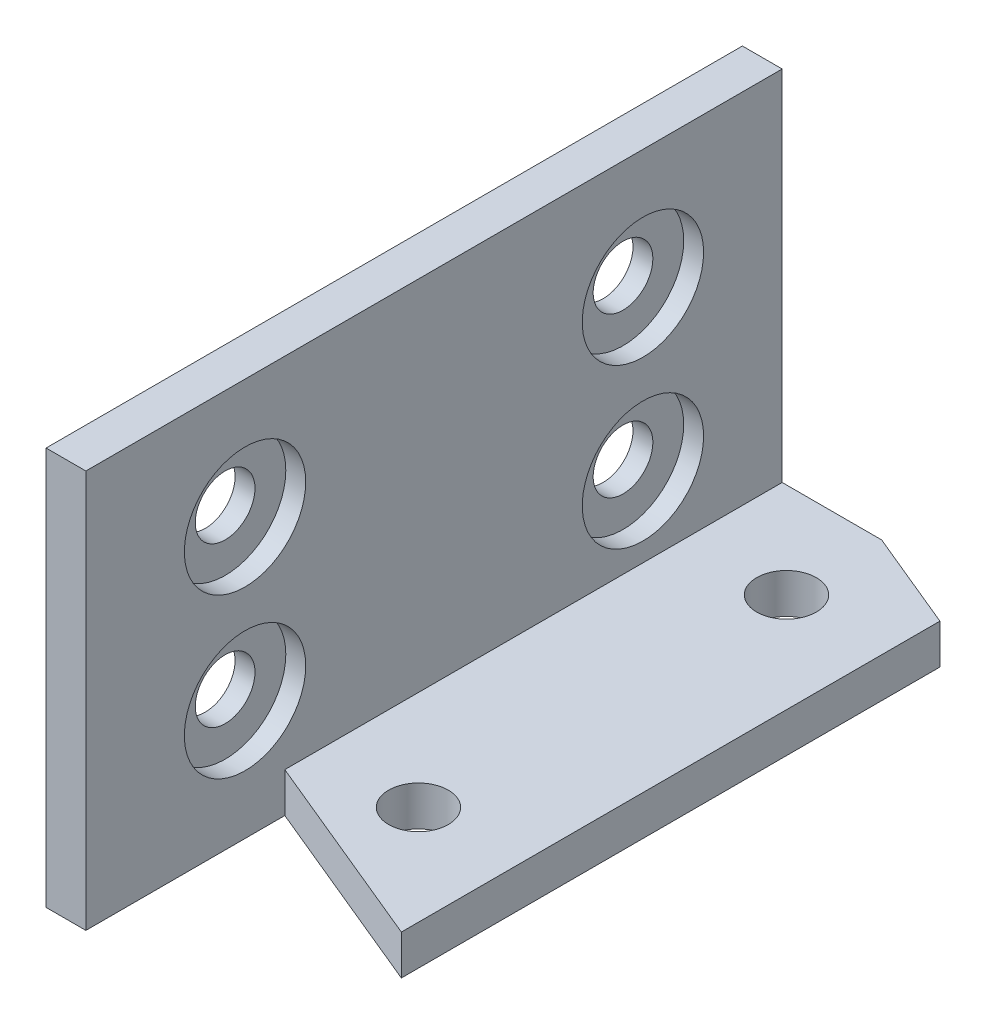
ISO-10303-21;
HEADER;
FILE_DESCRIPTION(('STEP AP214'),'2;1');
FILE_NAME('part.step','',(''),(''),'','','');
FILE_SCHEMA(('AUTOMOTIVE_DESIGN { 1 0 10303 214 1 1 1 1 }'));
ENDSEC;
DATA;
#1=APPLICATION_CONTEXT('core data for automotive mechanical design processes');
#2=APPLICATION_PROTOCOL_DEFINITION('international standard','automotive_design',2000,#1);
#3=PRODUCT_CONTEXT('',#1,'mechanical');
#4=PRODUCT('Part','Part','',(#3));
#5=PRODUCT_RELATED_PRODUCT_CATEGORY('part','',(#4));
#6=PRODUCT_DEFINITION_FORMATION('','',#4);
#7=PRODUCT_DEFINITION_CONTEXT('part definition',#1,'design');
#8=PRODUCT_DEFINITION('design','',#6,#7);
#9=PRODUCT_DEFINITION_SHAPE('','',#8);
#10=(LENGTH_UNIT() NAMED_UNIT(*) SI_UNIT(.MILLI.,.METRE.));
#11=(NAMED_UNIT(*) PLANE_ANGLE_UNIT() SI_UNIT($,.RADIAN.));
#12=(NAMED_UNIT(*) SI_UNIT($,.STERADIAN.) SOLID_ANGLE_UNIT());
#13=UNCERTAINTY_MEASURE_WITH_UNIT(LENGTH_MEASURE(1.E-05),#10,'distance_accuracy_value','');
#14=(GEOMETRIC_REPRESENTATION_CONTEXT(3) GLOBAL_UNCERTAINTY_ASSIGNED_CONTEXT((#13)) GLOBAL_UNIT_ASSIGNED_CONTEXT((#10,
#11,#12)) REPRESENTATION_CONTEXT('',''));
#15=CARTESIAN_POINT('',(0.,0.,0.));
#16=DIRECTION('',(0.,0.,1.));
#17=DIRECTION('',(1.,0.,0.));
#18=AXIS2_PLACEMENT_3D('',#15,#16,#17);
#19=CARTESIAN_POINT('',(-4.24264068711929,4.,-10.5));
#20=DIRECTION('',(1.,0.,0.));
#21=DIRECTION('',(0.,0.,-1.));
#22=AXIS2_PLACEMENT_3D('',#19,#20,#21);
#23=CYLINDRICAL_SURFACE('',#22,1.5);
#24=CARTESIAN_POINT('',(0.,4.,-10.5));
#25=DIRECTION('',(-1.,0.,0.));
#26=DIRECTION('',(0.,0.,1.));
#27=AXIS2_PLACEMENT_3D('',#24,#25,#26);
#28=CIRCLE('',#27,1.5);
#29=CARTESIAN_POINT('',(0.,4.,-9.));
#30=VERTEX_POINT('',#29);
#31=EDGE_CURVE('E179',#30,#30,#28,.F.);
#32=ORIENTED_EDGE('',*,*,#31,.F.);
#33=EDGE_LOOP('',(#32));
#34=FACE_BOUND('',#33,.T.);
#35=CARTESIAN_POINT('',(1.,4.,-10.5));
#36=DIRECTION('',(1.,0.,0.));
#37=DIRECTION('',(0.,0.,-1.));
#38=AXIS2_PLACEMENT_3D('',#35,#36,#37);
#39=CIRCLE('',#38,1.5);
#40=CARTESIAN_POINT('',(1.,4.,-12.));
#41=VERTEX_POINT('',#40);
#42=EDGE_CURVE('E49',#41,#41,#39,.F.);
#43=ORIENTED_EDGE('',*,*,#42,.F.);
#44=EDGE_LOOP('',(#43));
#45=FACE_BOUND('',#44,.T.);
#46=ADVANCED_FACE('F45',(#34,#45),#23,.F.);
#47=CARTESIAN_POINT('',(-4.24264068711929,-4.,-10.5));
#48=DIRECTION('',(1.,0.,0.));
#49=DIRECTION('',(0.,0.,-1.));
#50=AXIS2_PLACEMENT_3D('',#47,#48,#49);
#51=CYLINDRICAL_SURFACE('',#50,1.5);
#52=CARTESIAN_POINT('',(0.,-4.,-10.5));
#53=DIRECTION('',(-1.,0.,0.));
#54=DIRECTION('',(0.,0.,1.));
#55=AXIS2_PLACEMENT_3D('',#52,#53,#54);
#56=CIRCLE('',#55,1.5);
#57=CARTESIAN_POINT('',(0.,-4.,-9.00000000000001));
#58=VERTEX_POINT('',#57);
#59=EDGE_CURVE('E175',#58,#58,#56,.F.);
#60=ORIENTED_EDGE('',*,*,#59,.F.);
#61=EDGE_LOOP('',(#60));
#62=FACE_BOUND('',#61,.T.);
#63=CARTESIAN_POINT('',(1.,-4.,-10.5));
#64=DIRECTION('',(1.,0.,0.));
#65=DIRECTION('',(0.,0.,-1.));
#66=AXIS2_PLACEMENT_3D('',#63,#64,#65);
#67=CIRCLE('',#66,1.5);
#68=CARTESIAN_POINT('',(1.,-4.,-12.));
#69=VERTEX_POINT('',#68);
#70=EDGE_CURVE('E228',#69,#69,#67,.F.);
#71=ORIENTED_EDGE('',*,*,#70,.F.);
#72=EDGE_LOOP('',(#71));
#73=FACE_BOUND('',#72,.T.);
#74=ADVANCED_FACE('F314',(#62,#73),#51,.F.);
#75=CARTESIAN_POINT('',(-4.24264068711929,-4.,9.5));
#76=DIRECTION('',(1.,0.,0.));
#77=DIRECTION('',(0.,0.,-1.));
#78=AXIS2_PLACEMENT_3D('',#75,#76,#77);
#79=CYLINDRICAL_SURFACE('',#78,1.5);
#80=CARTESIAN_POINT('',(0.,-4.,9.5));
#81=DIRECTION('',(-1.,0.,0.));
#82=DIRECTION('',(0.,0.,1.));
#83=AXIS2_PLACEMENT_3D('',#80,#81,#82);
#84=CIRCLE('',#83,1.5);
#85=CARTESIAN_POINT('',(0.,-4.,11.));
#86=VERTEX_POINT('',#85);
#87=EDGE_CURVE('E180',#86,#86,#84,.F.);
#88=ORIENTED_EDGE('',*,*,#87,.F.);
#89=EDGE_LOOP('',(#88));
#90=FACE_BOUND('',#89,.T.);
#91=CARTESIAN_POINT('',(1.,-4.,9.5));
#92=DIRECTION('',(1.,0.,0.));
#93=DIRECTION('',(0.,0.,-1.));
#94=AXIS2_PLACEMENT_3D('',#91,#92,#93);
#95=CIRCLE('',#94,1.5);
#96=CARTESIAN_POINT('',(1.,-4.,8.));
#97=VERTEX_POINT('',#96);
#98=EDGE_CURVE('E224',#97,#97,#95,.F.);
#99=ORIENTED_EDGE('',*,*,#98,.F.);
#100=EDGE_LOOP('',(#99));
#101=FACE_BOUND('',#100,.T.);
#102=ADVANCED_FACE('F321',(#90,#101),#79,.F.);
#103=CARTESIAN_POINT('',(-4.24264068711929,4.,9.5));
#104=DIRECTION('',(1.,0.,0.));
#105=DIRECTION('',(0.,0.,-1.));
#106=AXIS2_PLACEMENT_3D('',#103,#104,#105);
#107=CYLINDRICAL_SURFACE('',#106,1.5);
#108=CARTESIAN_POINT('',(0.,4.,9.5));
#109=DIRECTION('',(-1.,0.,0.));
#110=DIRECTION('',(0.,0.,1.));
#111=AXIS2_PLACEMENT_3D('',#108,#109,#110);
#112=CIRCLE('',#111,1.5);
#113=CARTESIAN_POINT('',(0.,4.,11.));
#114=VERTEX_POINT('',#113);
#115=EDGE_CURVE('E169',#114,#114,#112,.F.);
#116=ORIENTED_EDGE('',*,*,#115,.F.);
#117=EDGE_LOOP('',(#116));
#118=FACE_BOUND('',#117,.T.);
#119=CARTESIAN_POINT('',(1.,4.,9.5));
#120=DIRECTION('',(1.,0.,0.));
#121=DIRECTION('',(0.,0.,-1.));
#122=AXIS2_PLACEMENT_3D('',#119,#120,#121);
#123=CIRCLE('',#122,1.5);
#124=CARTESIAN_POINT('',(1.,4.,8.));
#125=VERTEX_POINT('',#124);
#126=EDGE_CURVE('E220',#125,#125,#123,.F.);
#127=ORIENTED_EDGE('',*,*,#126,.F.);
#128=EDGE_LOOP('',(#127));
#129=FACE_BOUND('',#128,.T.);
#130=ADVANCED_FACE('F291',(#118,#129),#107,.F.);
#131=CARTESIAN_POINT('',(2.,0.,0.));
#132=DIRECTION('',(-1.,0.,0.));
#133=DIRECTION('',(0.,0.,1.));
#134=AXIS2_PLACEMENT_3D('',#131,#132,#133);
#135=PLANE('',#134);
#136=CARTESIAN_POINT('',(2.,4.,-10.5));
#137=DIRECTION('',(1.,0.,0.));
#138=DIRECTION('',(0.,0.,-1.));
#139=AXIS2_PLACEMENT_3D('',#136,#137,#138);
#140=CIRCLE('',#139,3.05);
#141=CARTESIAN_POINT('',(2.,4.,-13.55));
#142=VERTEX_POINT('',#141);
#143=EDGE_CURVE('E266',#142,#142,#140,.T.);
#144=ORIENTED_EDGE('',*,*,#143,.F.);
#145=EDGE_LOOP('',(#144));
#146=FACE_BOUND('',#145,.T.);
#147=CARTESIAN_POINT('',(2.,-4.,-10.5));
#148=DIRECTION('',(1.,0.,0.));
#149=DIRECTION('',(0.,0.,-1.));
#150=AXIS2_PLACEMENT_3D('',#147,#148,#149);
#151=CIRCLE('',#150,3.05);
#152=CARTESIAN_POINT('',(2.,-4.,-13.55));
#153=VERTEX_POINT('',#152);
#154=EDGE_CURVE('E274',#153,#153,#151,.T.);
#155=ORIENTED_EDGE('',*,*,#154,.F.);
#156=EDGE_LOOP('',(#155));
#157=FACE_BOUND('',#156,.T.);
#158=CARTESIAN_POINT('',(2.,-4.,9.5));
#159=DIRECTION('',(1.,0.,0.));
#160=DIRECTION('',(0.,0.,-1.));
#161=AXIS2_PLACEMENT_3D('',#158,#159,#160);
#162=CIRCLE('',#161,3.05);
#163=CARTESIAN_POINT('',(2.,-4.,6.45));
#164=VERTEX_POINT('',#163);
#165=EDGE_CURVE('E258',#164,#164,#162,.T.);
#166=ORIENTED_EDGE('',*,*,#165,.F.);
#167=EDGE_LOOP('',(#166));
#168=FACE_BOUND('',#167,.T.);
#169=CARTESIAN_POINT('',(2.,4.,9.5));
#170=DIRECTION('',(1.,0.,0.));
#171=DIRECTION('',(0.,0.,-1.));
#172=AXIS2_PLACEMENT_3D('',#169,#170,#171);
#173=CIRCLE('',#172,3.05);
#174=CARTESIAN_POINT('',(2.,4.,6.45));
#175=VERTEX_POINT('',#174);
#176=EDGE_CURVE('E254',#175,#175,#173,.T.);
#177=ORIENTED_EDGE('',*,*,#176,.F.);
#178=EDGE_LOOP('',(#177));
#179=FACE_BOUND('',#178,.T.);
#180=DIRECTION('',(0.,-1.,0.));
#181=VECTOR('',#180,1.);
#182=CARTESIAN_POINT('',(2.,-8.,7.5));
#183=LINE('',#182,#181);
#184=CARTESIAN_POINT('',(2.,-8.,7.5));
#185=VERTEX_POINT('',#184);
#186=CARTESIAN_POINT('',(2.,-10.,7.5));
#187=VERTEX_POINT('',#186);
#188=EDGE_CURVE('E166',#185,#187,#183,.T.);
#189=ORIENTED_EDGE('',*,*,#188,.F.);
#190=DIRECTION('',(0.,0.,-1.));
#191=VECTOR('',#190,1.);
#192=CARTESIAN_POINT('',(2.,-8.,-17.5));
#193=LINE('',#192,#191);
#194=CARTESIAN_POINT('',(2.,-8.,-17.5));
#195=VERTEX_POINT('',#194);
#196=EDGE_CURVE('E144',#185,#195,#193,.T.);
#197=ORIENTED_EDGE('',*,*,#196,.T.);
#198=DIRECTION('',(0.,1.,0.));
#199=VECTOR('',#198,1.);
#200=CARTESIAN_POINT('',(2.,-10.,-17.5));
#201=LINE('',#200,#199);
#202=CARTESIAN_POINT('',(2.,10.,-17.5));
#203=VERTEX_POINT('',#202);
#204=EDGE_CURVE('E97',#195,#203,#201,.T.);
#205=ORIENTED_EDGE('',*,*,#204,.T.);
#206=DIRECTION('',(0.,0.,1.));
#207=VECTOR('',#206,1.);
#208=CARTESIAN_POINT('',(2.,10.,17.5));
#209=LINE('',#208,#207);
#210=CARTESIAN_POINT('',(2.,10.,17.5));
#211=VERTEX_POINT('',#210);
#212=EDGE_CURVE('E193',#203,#211,#209,.T.);
#213=ORIENTED_EDGE('',*,*,#212,.T.);
#214=DIRECTION('',(0.,-1.,0.));
#215=VECTOR('',#214,1.);
#216=CARTESIAN_POINT('',(2.,-10.,17.5));
#217=LINE('',#216,#215);
#218=CARTESIAN_POINT('',(2.,-10.,17.5));
#219=VERTEX_POINT('',#218);
#220=EDGE_CURVE('E72',#211,#219,#217,.T.);
#221=ORIENTED_EDGE('',*,*,#220,.T.);
#222=DIRECTION('',(0.,0.,-1.));
#223=VECTOR('',#222,1.);
#224=CARTESIAN_POINT('',(2.,-10.,17.5));
#225=LINE('',#224,#223);
#226=EDGE_CURVE('E198',#219,#187,#225,.T.);
#227=ORIENTED_EDGE('',*,*,#226,.T.);
#228=EDGE_LOOP('',(#189,#197,#205,#213,#221,#227));
#229=FACE_BOUND('',#228,.T.);
#230=ADVANCED_FACE('F288',(#146,#157,#168,#179,#229),#135,.F.);
#231=CARTESIAN_POINT('',(2.,-10.,-17.5));
#232=DIRECTION('',(0.,0.,1.));
#233=DIRECTION('',(1.,0.,0.));
#234=AXIS2_PLACEMENT_3D('',#231,#232,#233);
#235=PLANE('',#234);
#236=DIRECTION('',(0.,1.,0.));
#237=VECTOR('',#236,1.);
#238=CARTESIAN_POINT('',(0.,-10.,-17.5));
#239=LINE('',#238,#237);
#240=CARTESIAN_POINT('',(0.,-10.,-17.5));
#241=VERTEX_POINT('',#240);
#242=CARTESIAN_POINT('',(0.,10.,-17.5));
#243=VERTEX_POINT('',#242);
#244=EDGE_CURVE('E190',#241,#243,#239,.T.);
#245=ORIENTED_EDGE('',*,*,#244,.T.);
#246=DIRECTION('',(-1.,0.,0.));
#247=VECTOR('',#246,1.);
#248=CARTESIAN_POINT('',(2.,10.,-17.5));
#249=LINE('',#248,#247);
#250=EDGE_CURVE('E11',#203,#243,#249,.T.);
#251=ORIENTED_EDGE('',*,*,#250,.F.);
#252=ORIENTED_EDGE('',*,*,#204,.F.);
#253=DIRECTION('',(1.,0.,0.));
#254=VECTOR('',#253,1.);
#255=CARTESIAN_POINT('',(2.,-8.,-17.5));
#256=LINE('',#255,#254);
#257=CARTESIAN_POINT('',(7.,-8.,-17.5));
#258=VERTEX_POINT('',#257);
#259=EDGE_CURVE('E63',#195,#258,#256,.T.);
#260=ORIENTED_EDGE('',*,*,#259,.T.);
#261=DIRECTION('',(0.,-1.,0.));
#262=VECTOR('',#261,1.);
#263=CARTESIAN_POINT('',(7.,-8.,-17.5));
#264=LINE('',#263,#262);
#265=CARTESIAN_POINT('',(7.,-10.,-17.5));
#266=VERTEX_POINT('',#265);
#267=EDGE_CURVE('E124',#258,#266,#264,.T.);
#268=ORIENTED_EDGE('',*,*,#267,.T.);
#269=DIRECTION('',(-1.,0.,0.));
#270=VECTOR('',#269,1.);
#271=CARTESIAN_POINT('',(2.,-10.,-17.5));
#272=LINE('',#271,#270);
#273=EDGE_CURVE('E201',#266,#241,#272,.T.);
#274=ORIENTED_EDGE('',*,*,#273,.T.);
#275=EDGE_LOOP('',(#245,#251,#252,#260,#268,#274));
#276=FACE_BOUND('',#275,.T.);
#277=ADVANCED_FACE('F47',(#276),#235,.F.);
#278=CARTESIAN_POINT('',(2.,10.,17.5));
#279=DIRECTION('',(0.,-1.,0.));
#280=DIRECTION('',(0.,0.,-1.));
#281=AXIS2_PLACEMENT_3D('',#278,#279,#280);
#282=PLANE('',#281);
#283=DIRECTION('',(0.,0.,1.));
#284=VECTOR('',#283,1.);
#285=CARTESIAN_POINT('',(0.,10.,17.5));
#286=LINE('',#285,#284);
#287=CARTESIAN_POINT('',(0.,10.,17.5));
#288=VERTEX_POINT('',#287);
#289=EDGE_CURVE('E204',#243,#288,#286,.T.);
#290=ORIENTED_EDGE('',*,*,#289,.T.);
#291=DIRECTION('',(-1.,0.,0.));
#292=VECTOR('',#291,1.);
#293=CARTESIAN_POINT('',(2.,10.,17.5));
#294=LINE('',#293,#292);
#295=EDGE_CURVE('E55',#211,#288,#294,.T.);
#296=ORIENTED_EDGE('',*,*,#295,.F.);
#297=ORIENTED_EDGE('',*,*,#212,.F.);
#298=ORIENTED_EDGE('',*,*,#250,.T.);
#299=EDGE_LOOP('',(#290,#296,#297,#298));
#300=FACE_BOUND('',#299,.T.);
#301=ADVANCED_FACE('F337',(#300),#282,.F.);
#302=CARTESIAN_POINT('',(2.,-10.,17.5));
#303=DIRECTION('',(0.,0.,-1.));
#304=DIRECTION('',(-1.,0.,0.));
#305=AXIS2_PLACEMENT_3D('',#302,#303,#304);
#306=PLANE('',#305);
#307=DIRECTION('',(0.,-1.,0.));
#308=VECTOR('',#307,1.);
#309=CARTESIAN_POINT('',(0.,-10.,17.5));
#310=LINE('',#309,#308);
#311=CARTESIAN_POINT('',(0.,-10.,17.5));
#312=VERTEX_POINT('',#311);
#313=EDGE_CURVE('E207',#288,#312,#310,.T.);
#314=ORIENTED_EDGE('',*,*,#313,.T.);
#315=DIRECTION('',(-1.,0.,0.));
#316=VECTOR('',#315,1.);
#317=CARTESIAN_POINT('',(2.,-10.,17.5));
#318=LINE('',#317,#316);
#319=EDGE_CURVE('E214',#219,#312,#318,.T.);
#320=ORIENTED_EDGE('',*,*,#319,.F.);
#321=ORIENTED_EDGE('',*,*,#220,.F.);
#322=ORIENTED_EDGE('',*,*,#295,.T.);
#323=EDGE_LOOP('',(#314,#320,#321,#322));
#324=FACE_BOUND('',#323,.T.);
#325=ADVANCED_FACE('F334',(#324),#306,.F.);
#326=CARTESIAN_POINT('',(2.,-10.,17.5));
#327=DIRECTION('',(0.,1.,0.));
#328=DIRECTION('',(0.,0.,1.));
#329=AXIS2_PLACEMENT_3D('',#326,#327,#328);
#330=PLANE('',#329);
#331=CARTESIAN_POINT('',(7.,-10.,-12.7173048891579));
#332=DIRECTION('',(0.,1.,0.));
#333=DIRECTION('',(0.,0.,1.));
#334=AXIS2_PLACEMENT_3D('',#331,#332,#333);
#335=CIRCLE('',#334,1.5);
#336=CARTESIAN_POINT('',(7.,-10.,-11.2173048891579));
#337=VERTEX_POINT('',#336);
#338=EDGE_CURVE('E159',#337,#337,#335,.F.);
#339=ORIENTED_EDGE('',*,*,#338,.F.);
#340=EDGE_LOOP('',(#339));
#341=FACE_BOUND('',#340,.T.);
#342=CARTESIAN_POINT('',(7.,-10.,5.78269511084207));
#343=DIRECTION('',(0.,1.,0.));
#344=DIRECTION('',(0.,0.,1.));
#345=AXIS2_PLACEMENT_3D('',#342,#343,#344);
#346=CIRCLE('',#345,1.5);
#347=CARTESIAN_POINT('',(7.,-10.,7.28269511084207));
#348=VERTEX_POINT('',#347);
#349=EDGE_CURVE('E235',#348,#348,#346,.F.);
#350=ORIENTED_EDGE('',*,*,#349,.F.);
#351=EDGE_LOOP('',(#350));
#352=FACE_BOUND('',#351,.T.);
#353=DIRECTION('',(0.,0.,-1.));
#354=VECTOR('',#353,1.);
#355=CARTESIAN_POINT('',(0.,-10.,17.5));
#356=LINE('',#355,#354);
#357=EDGE_CURVE('E93',#312,#241,#356,.T.);
#358=ORIENTED_EDGE('',*,*,#357,.T.);
#359=ORIENTED_EDGE('',*,*,#273,.F.);
#360=DIRECTION('',(0.923879532511289,0.,0.382683432365084));
#361=VECTOR('',#360,1.);
#362=CARTESIAN_POINT('',(7.,-10.,-17.5));
#363=LINE('',#362,#361);
#364=CARTESIAN_POINT('',(12.,-10.,-15.4289321881346));
#365=VERTEX_POINT('',#364);
#366=EDGE_CURVE('E128',#266,#365,#363,.T.);
#367=ORIENTED_EDGE('',*,*,#366,.T.);
#368=DIRECTION('',(0.,0.,1.));
#369=VECTOR('',#368,1.);
#370=CARTESIAN_POINT('',(12.,-10.,11.6421356237309));
#371=LINE('',#370,#369);
#372=CARTESIAN_POINT('',(12.,-10.,11.6421356237309));
#373=VERTEX_POINT('',#372);
#374=EDGE_CURVE('E158',#365,#373,#371,.T.);
#375=ORIENTED_EDGE('',*,*,#374,.T.);
#376=DIRECTION('',(-0.923879532511289,0.,-0.382683432365084));
#377=VECTOR('',#376,1.);
#378=CARTESIAN_POINT('',(2.,-10.,7.5));
#379=LINE('',#378,#377);
#380=EDGE_CURVE('E147',#373,#187,#379,.T.);
#381=ORIENTED_EDGE('',*,*,#380,.T.);
#382=ORIENTED_EDGE('',*,*,#226,.F.);
#383=ORIENTED_EDGE('',*,*,#319,.T.);
#384=EDGE_LOOP('',(#358,#359,#367,#375,#381,#382,#383));
#385=FACE_BOUND('',#384,.T.);
#386=ADVANCED_FACE('F300',(#341,#352,#385),#330,.F.);
#387=CARTESIAN_POINT('',(0.,0.,0.));
#388=DIRECTION('',(-1.,0.,0.));
#389=DIRECTION('',(0.,0.,1.));
#390=AXIS2_PLACEMENT_3D('',#387,#388,#389);
#391=PLANE('',#390);
#392=ORIENTED_EDGE('',*,*,#115,.T.);
#393=EDGE_LOOP('',(#392));
#394=FACE_BOUND('',#393,.T.);
#395=ORIENTED_EDGE('',*,*,#87,.T.);
#396=EDGE_LOOP('',(#395));
#397=FACE_BOUND('',#396,.T.);
#398=ORIENTED_EDGE('',*,*,#59,.T.);
#399=EDGE_LOOP('',(#398));
#400=FACE_BOUND('',#399,.T.);
#401=ORIENTED_EDGE('',*,*,#31,.T.);
#402=EDGE_LOOP('',(#401));
#403=FACE_BOUND('',#402,.T.);
#404=ORIENTED_EDGE('',*,*,#244,.F.);
#405=ORIENTED_EDGE('',*,*,#357,.F.);
#406=ORIENTED_EDGE('',*,*,#313,.F.);
#407=ORIENTED_EDGE('',*,*,#289,.F.);
#408=EDGE_LOOP('',(#404,#405,#406,#407));
#409=FACE_BOUND('',#408,.T.);
#410=ADVANCED_FACE('F311',(#394,#397,#400,#403,#409),#391,.T.);
#411=CARTESIAN_POINT('',(2.,-8.,7.5));
#412=DIRECTION('',(-0.382683432365084,0.,0.923879532511289));
#413=DIRECTION('',(0.923879532511289,0.,0.382683432365084));
#414=AXIS2_PLACEMENT_3D('',#411,#412,#413);
#415=PLANE('',#414);
#416=ORIENTED_EDGE('',*,*,#380,.F.);
#417=DIRECTION('',(0.,-1.,0.));
#418=VECTOR('',#417,1.);
#419=CARTESIAN_POINT('',(12.,-8.,11.6421356237309));
#420=LINE('',#419,#418);
#421=CARTESIAN_POINT('',(12.,-8.,11.6421356237309));
#422=VERTEX_POINT('',#421);
#423=EDGE_CURVE('E170',#422,#373,#420,.T.);
#424=ORIENTED_EDGE('',*,*,#423,.F.);
#425=DIRECTION('',(-0.923879532511289,0.,-0.382683432365084));
#426=VECTOR('',#425,1.);
#427=CARTESIAN_POINT('',(2.,-8.,7.5));
#428=LINE('',#427,#426);
#429=EDGE_CURVE('E132',#422,#185,#428,.T.);
#430=ORIENTED_EDGE('',*,*,#429,.T.);
#431=ORIENTED_EDGE('',*,*,#188,.T.);
#432=EDGE_LOOP('',(#416,#424,#430,#431));
#433=FACE_BOUND('',#432,.T.);
#434=ADVANCED_FACE('F299',(#433),#415,.T.);
#435=CARTESIAN_POINT('',(12.,-8.,11.6421356237309));
#436=DIRECTION('',(1.,0.,0.));
#437=DIRECTION('',(0.,0.,-1.));
#438=AXIS2_PLACEMENT_3D('',#435,#436,#437);
#439=PLANE('',#438);
#440=ORIENTED_EDGE('',*,*,#374,.F.);
#441=DIRECTION('',(0.,-1.,0.));
#442=VECTOR('',#441,1.);
#443=CARTESIAN_POINT('',(12.,-8.,-15.4289321881346));
#444=LINE('',#443,#442);
#445=CARTESIAN_POINT('',(12.,-8.,-15.4289321881346));
#446=VERTEX_POINT('',#445);
#447=EDGE_CURVE('E131',#446,#365,#444,.T.);
#448=ORIENTED_EDGE('',*,*,#447,.F.);
#449=DIRECTION('',(0.,0.,1.));
#450=VECTOR('',#449,1.);
#451=CARTESIAN_POINT('',(12.,-8.,11.6421356237309));
#452=LINE('',#451,#450);
#453=EDGE_CURVE('E138',#446,#422,#452,.T.);
#454=ORIENTED_EDGE('',*,*,#453,.T.);
#455=ORIENTED_EDGE('',*,*,#423,.T.);
#456=EDGE_LOOP('',(#440,#448,#454,#455));
#457=FACE_BOUND('',#456,.T.);
#458=ADVANCED_FACE('F303',(#457),#439,.T.);
#459=CARTESIAN_POINT('',(7.,-8.,-17.5));
#460=DIRECTION('',(0.382683432365084,0.,-0.923879532511289));
#461=DIRECTION('',(-0.923879532511289,0.,-0.382683432365084));
#462=AXIS2_PLACEMENT_3D('',#459,#460,#461);
#463=PLANE('',#462);
#464=ORIENTED_EDGE('',*,*,#366,.F.);
#465=ORIENTED_EDGE('',*,*,#267,.F.);
#466=DIRECTION('',(0.923879532511289,0.,0.382683432365084));
#467=VECTOR('',#466,1.);
#468=CARTESIAN_POINT('',(7.,-8.,-17.5));
#469=LINE('',#468,#467);
#470=EDGE_CURVE('E126',#258,#446,#469,.T.);
#471=ORIENTED_EDGE('',*,*,#470,.T.);
#472=ORIENTED_EDGE('',*,*,#447,.T.);
#473=EDGE_LOOP('',(#464,#465,#471,#472));
#474=FACE_BOUND('',#473,.T.);
#475=ADVANCED_FACE('F125',(#474),#463,.T.);
#476=CARTESIAN_POINT('',(0.,-8.,0.));
#477=DIRECTION('',(0.,1.,0.));
#478=DIRECTION('',(0.,0.,1.));
#479=AXIS2_PLACEMENT_3D('',#476,#477,#478);
#480=PLANE('',#479);
#481=CARTESIAN_POINT('',(7.,-8.,-12.7173048891579));
#482=DIRECTION('',(0.,1.,0.));
#483=DIRECTION('',(0.,0.,1.));
#484=AXIS2_PLACEMENT_3D('',#481,#482,#483);
#485=CIRCLE('',#484,1.5);
#486=CARTESIAN_POINT('',(7.,-8.,-11.2173048891579));
#487=VERTEX_POINT('',#486);
#488=EDGE_CURVE('E246',#487,#487,#485,.T.);
#489=ORIENTED_EDGE('',*,*,#488,.F.);
#490=EDGE_LOOP('',(#489));
#491=FACE_BOUND('',#490,.T.);
#492=CARTESIAN_POINT('',(7.,-8.,5.78269511084207));
#493=DIRECTION('',(0.,1.,0.));
#494=DIRECTION('',(0.,0.,1.));
#495=AXIS2_PLACEMENT_3D('',#492,#493,#494);
#496=CIRCLE('',#495,1.5);
#497=CARTESIAN_POINT('',(7.,-8.,7.28269511084207));
#498=VERTEX_POINT('',#497);
#499=EDGE_CURVE('E240',#498,#498,#496,.T.);
#500=ORIENTED_EDGE('',*,*,#499,.F.);
#501=EDGE_LOOP('',(#500));
#502=FACE_BOUND('',#501,.T.);
#503=ORIENTED_EDGE('',*,*,#196,.F.);
#504=ORIENTED_EDGE('',*,*,#429,.F.);
#505=ORIENTED_EDGE('',*,*,#453,.F.);
#506=ORIENTED_EDGE('',*,*,#470,.F.);
#507=ORIENTED_EDGE('',*,*,#259,.F.);
#508=EDGE_LOOP('',(#503,#504,#505,#506,#507));
#509=FACE_BOUND('',#508,.T.);
#510=ADVANCED_FACE('F135',(#491,#502,#509),#480,.T.);
#511=CARTESIAN_POINT('',(7.,-14.2426406871193,5.78269511084207));
#512=DIRECTION('',(0.,1.,0.));
#513=DIRECTION('',(0.,0.,1.));
#514=AXIS2_PLACEMENT_3D('',#511,#512,#513);
#515=CYLINDRICAL_SURFACE('',#514,1.5);
#516=ORIENTED_EDGE('',*,*,#349,.T.);
#517=EDGE_LOOP('',(#516));
#518=FACE_BOUND('',#517,.T.);
#519=ORIENTED_EDGE('',*,*,#499,.T.);
#520=EDGE_LOOP('',(#519));
#521=FACE_BOUND('',#520,.T.);
#522=ADVANCED_FACE('F383',(#518,#521),#515,.F.);
#523=CARTESIAN_POINT('',(7.,-14.2426406871193,-12.7173048891579));
#524=DIRECTION('',(0.,1.,0.));
#525=DIRECTION('',(0.,0.,1.));
#526=AXIS2_PLACEMENT_3D('',#523,#524,#525);
#527=CYLINDRICAL_SURFACE('',#526,1.5);
#528=ORIENTED_EDGE('',*,*,#338,.T.);
#529=EDGE_LOOP('',(#528));
#530=FACE_BOUND('',#529,.T.);
#531=ORIENTED_EDGE('',*,*,#488,.T.);
#532=EDGE_LOOP('',(#531));
#533=FACE_BOUND('',#532,.T.);
#534=ADVANCED_FACE('F393',(#530,#533),#527,.F.);
#535=CARTESIAN_POINT('',(1.,4.,9.5));
#536=DIRECTION('',(1.,0.,0.));
#537=DIRECTION('',(0.,0.,-1.));
#538=AXIS2_PLACEMENT_3D('',#535,#536,#537);
#539=PLANE('',#538);
#540=CARTESIAN_POINT('',(1.,4.,9.5));
#541=DIRECTION('',(1.,0.,0.));
#542=DIRECTION('',(0.,0.,-1.));
#543=AXIS2_PLACEMENT_3D('',#540,#541,#542);
#544=CIRCLE('',#543,3.05);
#545=CARTESIAN_POINT('',(1.,4.,6.45));
#546=VERTEX_POINT('',#545);
#547=EDGE_CURVE('E225',#546,#546,#544,.T.);
#548=ORIENTED_EDGE('',*,*,#547,.T.);
#549=EDGE_LOOP('',(#548));
#550=FACE_BOUND('',#549,.T.);
#551=ORIENTED_EDGE('',*,*,#126,.T.);
#552=EDGE_LOOP('',(#551));
#553=FACE_BOUND('',#552,.T.);
#554=ADVANCED_FACE('F401',(#550,#553),#539,.T.);
#555=CARTESIAN_POINT('',(1.,4.,9.5));
#556=DIRECTION('',(1.,0.,0.));
#557=DIRECTION('',(0.,0.,-1.));
#558=AXIS2_PLACEMENT_3D('',#555,#556,#557);
#559=CYLINDRICAL_SURFACE('',#558,3.05);
#560=ORIENTED_EDGE('',*,*,#547,.F.);
#561=EDGE_LOOP('',(#560));
#562=FACE_BOUND('',#561,.T.);
#563=ORIENTED_EDGE('',*,*,#176,.T.);
#564=EDGE_LOOP('',(#563));
#565=FACE_BOUND('',#564,.T.);
#566=ADVANCED_FACE('F434',(#562,#565),#559,.F.);
#567=CARTESIAN_POINT('',(1.,-4.,9.5));
#568=DIRECTION('',(1.,0.,0.));
#569=DIRECTION('',(0.,0.,-1.));
#570=AXIS2_PLACEMENT_3D('',#567,#568,#569);
#571=PLANE('',#570);
#572=CARTESIAN_POINT('',(1.,-4.,9.5));
#573=DIRECTION('',(1.,0.,0.));
#574=DIRECTION('',(0.,0.,-1.));
#575=AXIS2_PLACEMENT_3D('',#572,#573,#574);
#576=CIRCLE('',#575,3.05);
#577=CARTESIAN_POINT('',(1.,-4.,6.45));
#578=VERTEX_POINT('',#577);
#579=EDGE_CURVE('E278',#578,#578,#576,.T.);
#580=ORIENTED_EDGE('',*,*,#579,.T.);
#581=EDGE_LOOP('',(#580));
#582=FACE_BOUND('',#581,.T.);
#583=ORIENTED_EDGE('',*,*,#98,.T.);
#584=EDGE_LOOP('',(#583));
#585=FACE_BOUND('',#584,.T.);
#586=ADVANCED_FACE('F444',(#582,#585),#571,.T.);
#587=CARTESIAN_POINT('',(1.,-4.,9.5));
#588=DIRECTION('',(1.,0.,0.));
#589=DIRECTION('',(0.,0.,-1.));
#590=AXIS2_PLACEMENT_3D('',#587,#588,#589);
#591=CYLINDRICAL_SURFACE('',#590,3.05);
#592=ORIENTED_EDGE('',*,*,#579,.F.);
#593=EDGE_LOOP('',(#592));
#594=FACE_BOUND('',#593,.T.);
#595=ORIENTED_EDGE('',*,*,#165,.T.);
#596=EDGE_LOOP('',(#595));
#597=FACE_BOUND('',#596,.T.);
#598=ADVANCED_FACE('F286',(#594,#597),#591,.F.);
#599=CARTESIAN_POINT('',(1.,-4.,-10.5));
#600=DIRECTION('',(1.,0.,0.));
#601=DIRECTION('',(0.,0.,-1.));
#602=AXIS2_PLACEMENT_3D('',#599,#600,#601);
#603=PLANE('',#602);
#604=CARTESIAN_POINT('',(1.,-4.,-10.5));
#605=DIRECTION('',(1.,0.,0.));
#606=DIRECTION('',(0.,0.,-1.));
#607=AXIS2_PLACEMENT_3D('',#604,#605,#606);
#608=CIRCLE('',#607,3.05);
#609=CARTESIAN_POINT('',(1.,-4.,-13.55));
#610=VERTEX_POINT('',#609);
#611=EDGE_CURVE('E270',#610,#610,#608,.T.);
#612=ORIENTED_EDGE('',*,*,#611,.T.);
#613=EDGE_LOOP('',(#612));
#614=FACE_BOUND('',#613,.T.);
#615=ORIENTED_EDGE('',*,*,#70,.T.);
#616=EDGE_LOOP('',(#615));
#617=FACE_BOUND('',#616,.T.);
#618=ADVANCED_FACE('F463',(#614,#617),#603,.T.);
#619=CARTESIAN_POINT('',(1.,-4.,-10.5));
#620=DIRECTION('',(1.,0.,0.));
#621=DIRECTION('',(0.,0.,-1.));
#622=AXIS2_PLACEMENT_3D('',#619,#620,#621);
#623=CYLINDRICAL_SURFACE('',#622,3.05);
#624=ORIENTED_EDGE('',*,*,#611,.F.);
#625=EDGE_LOOP('',(#624));
#626=FACE_BOUND('',#625,.T.);
#627=ORIENTED_EDGE('',*,*,#154,.T.);
#628=EDGE_LOOP('',(#627));
#629=FACE_BOUND('',#628,.T.);
#630=ADVANCED_FACE('F473',(#626,#629),#623,.F.);
#631=CARTESIAN_POINT('',(1.,4.,-10.5));
#632=DIRECTION('',(1.,0.,0.));
#633=DIRECTION('',(0.,0.,-1.));
#634=AXIS2_PLACEMENT_3D('',#631,#632,#633);
#635=PLANE('',#634);
#636=CARTESIAN_POINT('',(1.,4.,-10.5));
#637=DIRECTION('',(1.,0.,0.));
#638=DIRECTION('',(0.,0.,-1.));
#639=AXIS2_PLACEMENT_3D('',#636,#637,#638);
#640=CIRCLE('',#639,3.05);
#641=CARTESIAN_POINT('',(1.,4.,-13.55));
#642=VERTEX_POINT('',#641);
#643=EDGE_CURVE('E262',#642,#642,#640,.T.);
#644=ORIENTED_EDGE('',*,*,#643,.T.);
#645=EDGE_LOOP('',(#644));
#646=FACE_BOUND('',#645,.T.);
#647=ORIENTED_EDGE('',*,*,#42,.T.);
#648=EDGE_LOOP('',(#647));
#649=FACE_BOUND('',#648,.T.);
#650=ADVANCED_FACE('F483',(#646,#649),#635,.T.);
#651=CARTESIAN_POINT('',(1.,4.,-10.5));
#652=DIRECTION('',(1.,0.,0.));
#653=DIRECTION('',(0.,0.,-1.));
#654=AXIS2_PLACEMENT_3D('',#651,#652,#653);
#655=CYLINDRICAL_SURFACE('',#654,3.05);
#656=ORIENTED_EDGE('',*,*,#643,.F.);
#657=EDGE_LOOP('',(#656));
#658=FACE_BOUND('',#657,.T.);
#659=ORIENTED_EDGE('',*,*,#143,.T.);
#660=EDGE_LOOP('',(#659));
#661=FACE_BOUND('',#660,.T.);
#662=ADVANCED_FACE('F493',(#658,#661),#655,.F.);
#663=CLOSED_SHELL('',(#46,#74,#102,#130,#230,#277,#301,#325,#386,#410,#434,#458,#475,#510,#522,
#534,#554,#566,#586,#598,#618,#630,#650,#662));
#664=MANIFOLD_SOLID_BREP('B2',#663);
#665=ADVANCED_BREP_SHAPE_REPRESENTATION('',(#18,#664),#14);
#666=SHAPE_DEFINITION_REPRESENTATION(#9,#665);
ENDSEC;
END-ISO-10303-21;
